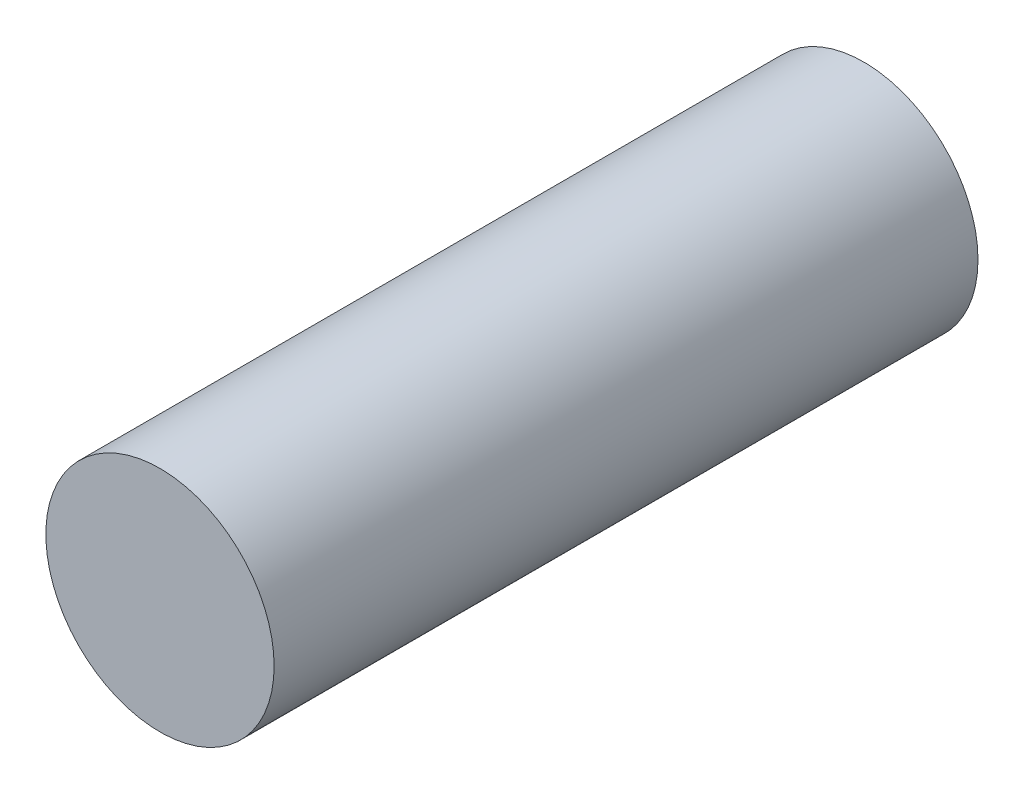
ISO-10303-21;
HEADER;
FILE_DESCRIPTION(('STEP AP214'),'2;1');
FILE_NAME('part.step','',(''),(''),'','','');
FILE_SCHEMA(('AUTOMOTIVE_DESIGN { 1 0 10303 214 1 1 1 1 }'));
ENDSEC;
DATA;
#1=APPLICATION_CONTEXT('core data for automotive mechanical design processes');
#2=APPLICATION_PROTOCOL_DEFINITION('international standard','automotive_design',2000,#1);
#3=PRODUCT_CONTEXT('',#1,'mechanical');
#4=PRODUCT('Part','Part','',(#3));
#5=PRODUCT_RELATED_PRODUCT_CATEGORY('part','',(#4));
#6=PRODUCT_DEFINITION_FORMATION('','',#4);
#7=PRODUCT_DEFINITION_CONTEXT('part definition',#1,'design');
#8=PRODUCT_DEFINITION('design','',#6,#7);
#9=PRODUCT_DEFINITION_SHAPE('','',#8);
#10=(LENGTH_UNIT() NAMED_UNIT(*) SI_UNIT(.MILLI.,.METRE.));
#11=(NAMED_UNIT(*) PLANE_ANGLE_UNIT() SI_UNIT($,.RADIAN.));
#12=(NAMED_UNIT(*) SI_UNIT($,.STERADIAN.) SOLID_ANGLE_UNIT());
#13=UNCERTAINTY_MEASURE_WITH_UNIT(LENGTH_MEASURE(1.E-05),#10,'distance_accuracy_value','');
#14=(GEOMETRIC_REPRESENTATION_CONTEXT(3) GLOBAL_UNCERTAINTY_ASSIGNED_CONTEXT((#13)) GLOBAL_UNIT_ASSIGNED_CONTEXT((#10,
#11,#12)) REPRESENTATION_CONTEXT('',''));
#15=CARTESIAN_POINT('',(0.,0.,0.));
#16=DIRECTION('',(0.,0.,1.));
#17=DIRECTION('',(1.,0.,0.));
#18=AXIS2_PLACEMENT_3D('',#15,#16,#17);
#19=CARTESIAN_POINT('',(0.,0.,-74.));
#20=DIRECTION('',(0.,0.,1.));
#21=DIRECTION('',(1.,0.,0.));
#22=AXIS2_PLACEMENT_3D('',#19,#20,#21);
#23=CYLINDRICAL_SURFACE('',#22,12.);
#24=CARTESIAN_POINT('',(0.,0.,-74.));
#25=DIRECTION('',(0.,0.,1.));
#26=DIRECTION('',(1.,0.,0.));
#27=AXIS2_PLACEMENT_3D('',#24,#25,#26);
#28=CIRCLE('',#27,12.);
#29=CARTESIAN_POINT('',(12.,0.,-74.));
#30=VERTEX_POINT('',#29);
#31=EDGE_CURVE('E10',#30,#30,#28,.T.);
#32=ORIENTED_EDGE('',*,*,#31,.T.);
#33=EDGE_LOOP('',(#32));
#34=FACE_BOUND('',#33,.T.);
#35=CARTESIAN_POINT('',(0.,0.,0.));
#36=DIRECTION('',(0.,0.,1.));
#37=DIRECTION('',(1.,0.,0.));
#38=AXIS2_PLACEMENT_3D('',#35,#36,#37);
#39=CIRCLE('',#38,12.);
#40=CARTESIAN_POINT('',(12.,0.,0.));
#41=VERTEX_POINT('',#40);
#42=EDGE_CURVE('E44',#41,#41,#39,.T.);
#43=ORIENTED_EDGE('',*,*,#42,.F.);
#44=EDGE_LOOP('',(#43));
#45=FACE_BOUND('',#44,.T.);
#46=ADVANCED_FACE('F41',(#34,#45),#23,.T.);
#47=CARTESIAN_POINT('',(0.,0.,-74.));
#48=DIRECTION('',(0.,0.,1.));
#49=DIRECTION('',(1.,0.,0.));
#50=AXIS2_PLACEMENT_3D('',#47,#48,#49);
#51=PLANE('',#50);
#52=ORIENTED_EDGE('',*,*,#31,.F.);
#53=EDGE_LOOP('',(#52));
#54=FACE_BOUND('',#53,.T.);
#55=ADVANCED_FACE('F58',(#54),#51,.F.);
#56=CARTESIAN_POINT('',(0.,0.,0.));
#57=DIRECTION('',(0.,0.,1.));
#58=DIRECTION('',(1.,0.,0.));
#59=AXIS2_PLACEMENT_3D('',#56,#57,#58);
#60=PLANE('',#59);
#61=ORIENTED_EDGE('',*,*,#42,.T.);
#62=EDGE_LOOP('',(#61));
#63=FACE_BOUND('',#62,.T.);
#64=ADVANCED_FACE('F55',(#63),#60,.T.);
#65=CLOSED_SHELL('',(#46,#55,#64));
#66=MANIFOLD_SOLID_BREP('B2',#65);
#67=ADVANCED_BREP_SHAPE_REPRESENTATION('',(#18,#66),#14);
#68=SHAPE_DEFINITION_REPRESENTATION(#9,#67);
ENDSEC;
END-ISO-10303-21;
